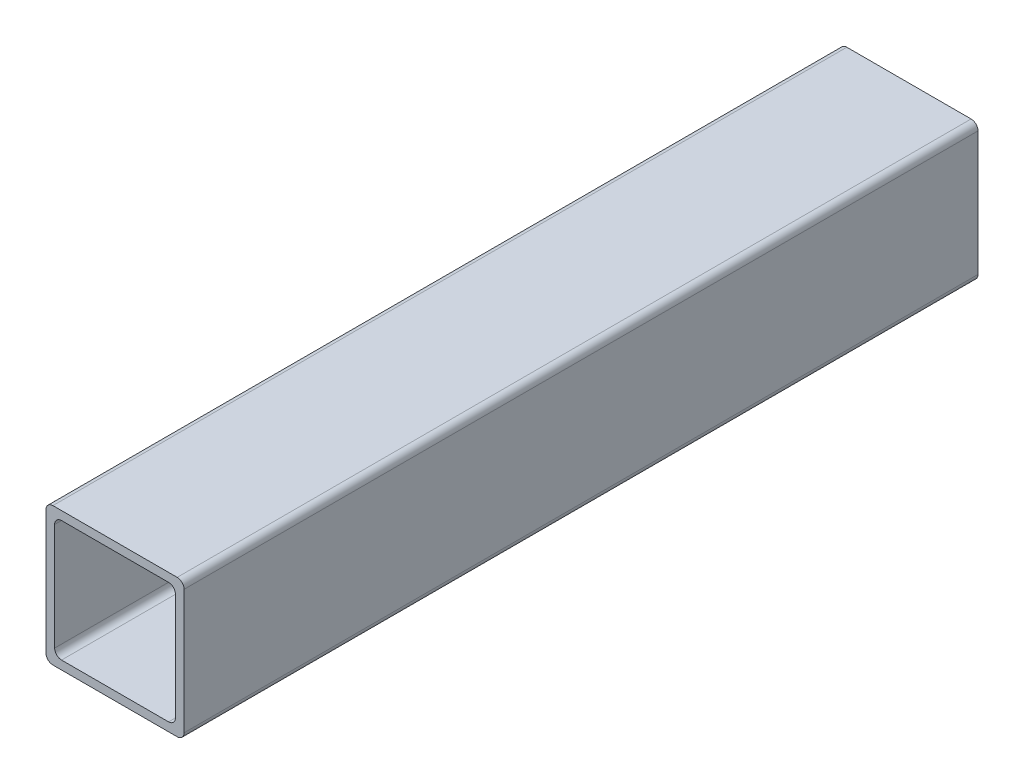
ISO-10303-21;
HEADER;
FILE_DESCRIPTION(('STEP AP214'),'2;1');
FILE_NAME('part.step','',(''),(''),'','','');
FILE_SCHEMA(('AUTOMOTIVE_DESIGN { 1 0 10303 214 1 1 1 1 }'));
ENDSEC;
DATA;
#1=APPLICATION_CONTEXT('core data for automotive mechanical design processes');
#2=APPLICATION_PROTOCOL_DEFINITION('international standard','automotive_design',2000,#1);
#3=PRODUCT_CONTEXT('',#1,'mechanical');
#4=PRODUCT('Part','Part','',(#3));
#5=PRODUCT_RELATED_PRODUCT_CATEGORY('part','',(#4));
#6=PRODUCT_DEFINITION_FORMATION('','',#4);
#7=PRODUCT_DEFINITION_CONTEXT('part definition',#1,'design');
#8=PRODUCT_DEFINITION('design','',#6,#7);
#9=PRODUCT_DEFINITION_SHAPE('','',#8);
#10=(LENGTH_UNIT() NAMED_UNIT(*) SI_UNIT(.MILLI.,.METRE.));
#11=(NAMED_UNIT(*) PLANE_ANGLE_UNIT() SI_UNIT($,.RADIAN.));
#12=(NAMED_UNIT(*) SI_UNIT($,.STERADIAN.) SOLID_ANGLE_UNIT());
#13=UNCERTAINTY_MEASURE_WITH_UNIT(LENGTH_MEASURE(1.E-05),#10,'distance_accuracy_value','');
#14=(GEOMETRIC_REPRESENTATION_CONTEXT(3) GLOBAL_UNCERTAINTY_ASSIGNED_CONTEXT((#13)) GLOBAL_UNIT_ASSIGNED_CONTEXT((#10,
#11,#12)) REPRESENTATION_CONTEXT('',''));
#15=CARTESIAN_POINT('',(0.,0.,0.));
#16=DIRECTION('',(0.,0.,1.));
#17=DIRECTION('',(1.,0.,0.));
#18=AXIS2_PLACEMENT_3D('',#15,#16,#17);
#19=CARTESIAN_POINT('',(-22.86,-22.86,146.05));
#20=DIRECTION('',(0.,0.,-1.));
#21=DIRECTION('',(-1.,0.,0.));
#22=AXIS2_PLACEMENT_3D('',#19,#20,#21);
#23=PLANE('',#22);
#24=CARTESIAN_POINT('',(-22.86,-22.86,146.05));
#25=DIRECTION('',(0.,0.,1.));
#26=DIRECTION('',(-1.,0.,0.));
#27=AXIS2_PLACEMENT_3D('',#24,#25,#26);
#28=CIRCLE('',#27,2.54);
#29=CARTESIAN_POINT('',(-25.4,-22.86,146.05));
#30=VERTEX_POINT('',#29);
#31=CARTESIAN_POINT('',(-22.86,-25.4,146.05));
#32=VERTEX_POINT('',#31);
#33=EDGE_CURVE('E211',#30,#32,#28,.T.);
#34=ORIENTED_EDGE('',*,*,#33,.T.);
#35=DIRECTION('',(1.,0.,0.));
#36=VECTOR('',#35,1.);
#37=CARTESIAN_POINT('',(-22.86,-25.4,146.05));
#38=LINE('',#37,#36);
#39=CARTESIAN_POINT('',(22.86,-25.4,146.05));
#40=VERTEX_POINT('',#39);
#41=EDGE_CURVE('E214',#32,#40,#38,.T.);
#42=ORIENTED_EDGE('',*,*,#41,.T.);
#43=CARTESIAN_POINT('',(22.86,-22.86,146.05));
#44=DIRECTION('',(0.,0.,1.));
#45=DIRECTION('',(1.,0.,0.));
#46=AXIS2_PLACEMENT_3D('',#43,#44,#45);
#47=CIRCLE('',#46,2.54);
#48=CARTESIAN_POINT('',(25.4,-22.86,146.05));
#49=VERTEX_POINT('',#48);
#50=EDGE_CURVE('E217',#40,#49,#47,.T.);
#51=ORIENTED_EDGE('',*,*,#50,.T.);
#52=DIRECTION('',(0.,1.,0.));
#53=VECTOR('',#52,1.);
#54=CARTESIAN_POINT('',(25.4,-22.86,146.05));
#55=LINE('',#54,#53);
#56=CARTESIAN_POINT('',(25.4,22.86,146.05));
#57=VERTEX_POINT('',#56);
#58=EDGE_CURVE('E219',#49,#57,#55,.T.);
#59=ORIENTED_EDGE('',*,*,#58,.T.);
#60=CARTESIAN_POINT('',(22.86,22.86,146.05));
#61=DIRECTION('',(0.,0.,1.));
#62=DIRECTION('',(-1.,0.,0.));
#63=AXIS2_PLACEMENT_3D('',#60,#61,#62);
#64=CIRCLE('',#63,2.54);
#65=CARTESIAN_POINT('',(22.86,25.4,146.05));
#66=VERTEX_POINT('',#65);
#67=EDGE_CURVE('E221',#57,#66,#64,.T.);
#68=ORIENTED_EDGE('',*,*,#67,.T.);
#69=DIRECTION('',(-1.,0.,0.));
#70=VECTOR('',#69,1.);
#71=CARTESIAN_POINT('',(-22.86,25.4,146.05));
#72=LINE('',#71,#70);
#73=CARTESIAN_POINT('',(-22.86,25.4,146.05));
#74=VERTEX_POINT('',#73);
#75=EDGE_CURVE('E223',#66,#74,#72,.T.);
#76=ORIENTED_EDGE('',*,*,#75,.T.);
#77=CARTESIAN_POINT('',(-22.86,22.86,146.05));
#78=DIRECTION('',(0.,0.,1.));
#79=DIRECTION('',(-1.,0.,0.));
#80=AXIS2_PLACEMENT_3D('',#77,#78,#79);
#81=CIRCLE('',#80,2.54);
#82=CARTESIAN_POINT('',(-25.4,22.86,146.05));
#83=VERTEX_POINT('',#82);
#84=EDGE_CURVE('E225',#74,#83,#81,.T.);
#85=ORIENTED_EDGE('',*,*,#84,.T.);
#86=DIRECTION('',(0.,-1.,0.));
#87=VECTOR('',#86,1.);
#88=CARTESIAN_POINT('',(-25.4,-22.86,146.05));
#89=LINE('',#88,#87);
#90=EDGE_CURVE('E227',#83,#30,#89,.T.);
#91=ORIENTED_EDGE('',*,*,#90,.T.);
#92=EDGE_LOOP('',(#34,#42,#51,#59,#68,#76,#85,#91));
#93=FACE_BOUND('',#92,.T.);
#94=CARTESIAN_POINT('',(-19.685,-19.685,146.05));
#95=DIRECTION('',(0.,0.,1.));
#96=DIRECTION('',(-1.,0.,0.));
#97=AXIS2_PLACEMENT_3D('',#94,#95,#96);
#98=CIRCLE('',#97,2.54);
#99=CARTESIAN_POINT('',(-22.225,-19.685,146.05));
#100=VERTEX_POINT('',#99);
#101=CARTESIAN_POINT('',(-19.685,-22.225,146.05));
#102=VERTEX_POINT('',#101);
#103=EDGE_CURVE('E146',#100,#102,#98,.T.);
#104=ORIENTED_EDGE('',*,*,#103,.F.);
#105=DIRECTION('',(0.,-1.,0.));
#106=VECTOR('',#105,1.);
#107=CARTESIAN_POINT('',(-22.225,-19.685,146.05));
#108=LINE('',#107,#106);
#109=CARTESIAN_POINT('',(-22.225,19.685,146.05));
#110=VERTEX_POINT('',#109);
#111=EDGE_CURVE('E179',#110,#100,#108,.T.);
#112=ORIENTED_EDGE('',*,*,#111,.F.);
#113=CARTESIAN_POINT('',(-19.685,19.685,146.05));
#114=DIRECTION('',(0.,0.,1.));
#115=DIRECTION('',(1.,0.,0.));
#116=AXIS2_PLACEMENT_3D('',#113,#114,#115);
#117=CIRCLE('',#116,2.54);
#118=CARTESIAN_POINT('',(-19.685,22.225,146.05));
#119=VERTEX_POINT('',#118);
#120=EDGE_CURVE('E177',#119,#110,#117,.T.);
#121=ORIENTED_EDGE('',*,*,#120,.F.);
#122=DIRECTION('',(-1.,0.,0.));
#123=VECTOR('',#122,1.);
#124=CARTESIAN_POINT('',(-19.685,22.225,146.05));
#125=LINE('',#124,#123);
#126=CARTESIAN_POINT('',(19.685,22.225,146.05));
#127=VERTEX_POINT('',#126);
#128=EDGE_CURVE('E175',#127,#119,#125,.T.);
#129=ORIENTED_EDGE('',*,*,#128,.F.);
#130=CARTESIAN_POINT('',(19.685,19.685,146.05));
#131=DIRECTION('',(0.,0.,1.));
#132=DIRECTION('',(-1.,0.,0.));
#133=AXIS2_PLACEMENT_3D('',#130,#131,#132);
#134=CIRCLE('',#133,2.54);
#135=CARTESIAN_POINT('',(22.225,19.685,146.05));
#136=VERTEX_POINT('',#135);
#137=EDGE_CURVE('E173',#136,#127,#134,.T.);
#138=ORIENTED_EDGE('',*,*,#137,.F.);
#139=DIRECTION('',(0.,1.,0.));
#140=VECTOR('',#139,1.);
#141=CARTESIAN_POINT('',(22.225,-19.685,146.05));
#142=LINE('',#141,#140);
#143=CARTESIAN_POINT('',(22.225,-19.685,146.05));
#144=VERTEX_POINT('',#143);
#145=EDGE_CURVE('E169',#144,#136,#142,.T.);
#146=ORIENTED_EDGE('',*,*,#145,.F.);
#147=CARTESIAN_POINT('',(19.685,-19.685,146.05));
#148=DIRECTION('',(0.,0.,1.));
#149=DIRECTION('',(-1.,0.,0.));
#150=AXIS2_PLACEMENT_3D('',#147,#148,#149);
#151=CIRCLE('',#150,2.54);
#152=CARTESIAN_POINT('',(19.685,-22.225,146.05));
#153=VERTEX_POINT('',#152);
#154=EDGE_CURVE('E167',#153,#144,#151,.T.);
#155=ORIENTED_EDGE('',*,*,#154,.F.);
#156=DIRECTION('',(1.,0.,0.));
#157=VECTOR('',#156,1.);
#158=CARTESIAN_POINT('',(-19.685,-22.225,146.05));
#159=LINE('',#158,#157);
#160=EDGE_CURVE('E154',#102,#153,#159,.T.);
#161=ORIENTED_EDGE('',*,*,#160,.F.);
#162=EDGE_LOOP('',(#104,#112,#121,#129,#138,#146,#155,#161));
#163=FACE_BOUND('',#162,.T.);
#164=ADVANCED_FACE('F33',(#93,#163),#23,.F.);
#165=CARTESIAN_POINT('',(-22.86,-22.86,-146.05));
#166=DIRECTION('',(0.,0.,-1.));
#167=DIRECTION('',(-1.,0.,0.));
#168=AXIS2_PLACEMENT_3D('',#165,#166,#167);
#169=PLANE('',#168);
#170=CARTESIAN_POINT('',(-22.86,-22.86,-146.05));
#171=DIRECTION('',(0.,0.,1.));
#172=DIRECTION('',(-1.,0.,0.));
#173=AXIS2_PLACEMENT_3D('',#170,#171,#172);
#174=CIRCLE('',#173,2.54);
#175=CARTESIAN_POINT('',(-25.4,-22.86,-146.05));
#176=VERTEX_POINT('',#175);
#177=CARTESIAN_POINT('',(-22.86,-25.4,-146.05));
#178=VERTEX_POINT('',#177);
#179=EDGE_CURVE('E162',#176,#178,#174,.T.);
#180=ORIENTED_EDGE('',*,*,#179,.F.);
#181=DIRECTION('',(0.,-1.,0.));
#182=VECTOR('',#181,1.);
#183=CARTESIAN_POINT('',(-25.4,-22.86,-146.05));
#184=LINE('',#183,#182);
#185=CARTESIAN_POINT('',(-25.4,22.86,-146.05));
#186=VERTEX_POINT('',#185);
#187=EDGE_CURVE('E215',#186,#176,#184,.T.);
#188=ORIENTED_EDGE('',*,*,#187,.F.);
#189=CARTESIAN_POINT('',(-22.86,22.86,-146.05));
#190=DIRECTION('',(0.,0.,1.));
#191=DIRECTION('',(-1.,0.,0.));
#192=AXIS2_PLACEMENT_3D('',#189,#190,#191);
#193=CIRCLE('',#192,2.54);
#194=CARTESIAN_POINT('',(-22.86,25.4,-146.05));
#195=VERTEX_POINT('',#194);
#196=EDGE_CURVE('E242',#195,#186,#193,.T.);
#197=ORIENTED_EDGE('',*,*,#196,.F.);
#198=DIRECTION('',(-1.,0.,0.));
#199=VECTOR('',#198,1.);
#200=CARTESIAN_POINT('',(-22.86,25.4,-146.05));
#201=LINE('',#200,#199);
#202=CARTESIAN_POINT('',(22.86,25.4,-146.05));
#203=VERTEX_POINT('',#202);
#204=EDGE_CURVE('E240',#203,#195,#201,.T.);
#205=ORIENTED_EDGE('',*,*,#204,.F.);
#206=CARTESIAN_POINT('',(22.86,22.86,-146.05));
#207=DIRECTION('',(0.,0.,1.));
#208=DIRECTION('',(-1.,0.,0.));
#209=AXIS2_PLACEMENT_3D('',#206,#207,#208);
#210=CIRCLE('',#209,2.54);
#211=CARTESIAN_POINT('',(25.4,22.86,-146.05));
#212=VERTEX_POINT('',#211);
#213=EDGE_CURVE('E238',#212,#203,#210,.T.);
#214=ORIENTED_EDGE('',*,*,#213,.F.);
#215=DIRECTION('',(0.,1.,0.));
#216=VECTOR('',#215,1.);
#217=CARTESIAN_POINT('',(25.4,-22.86,-146.05));
#218=LINE('',#217,#216);
#219=CARTESIAN_POINT('',(25.4,-22.86,-146.05));
#220=VERTEX_POINT('',#219);
#221=EDGE_CURVE('E236',#220,#212,#218,.T.);
#222=ORIENTED_EDGE('',*,*,#221,.F.);
#223=CARTESIAN_POINT('',(22.86,-22.86,-146.05));
#224=DIRECTION('',(0.,0.,1.));
#225=DIRECTION('',(1.,0.,0.));
#226=AXIS2_PLACEMENT_3D('',#223,#224,#225);
#227=CIRCLE('',#226,2.54);
#228=CARTESIAN_POINT('',(22.86,-25.4,-146.05));
#229=VERTEX_POINT('',#228);
#230=EDGE_CURVE('E234',#229,#220,#227,.T.);
#231=ORIENTED_EDGE('',*,*,#230,.F.);
#232=DIRECTION('',(1.,0.,0.));
#233=VECTOR('',#232,1.);
#234=CARTESIAN_POINT('',(-22.86,-25.4,-146.05));
#235=LINE('',#234,#233);
#236=EDGE_CURVE('E232',#178,#229,#235,.T.);
#237=ORIENTED_EDGE('',*,*,#236,.F.);
#238=EDGE_LOOP('',(#180,#188,#197,#205,#214,#222,#231,#237));
#239=FACE_BOUND('',#238,.T.);
#240=DIRECTION('',(0.,-1.,0.));
#241=VECTOR('',#240,1.);
#242=CARTESIAN_POINT('',(-22.225,-19.685,-146.05));
#243=LINE('',#242,#241);
#244=CARTESIAN_POINT('',(-22.225,19.685,-146.05));
#245=VERTEX_POINT('',#244);
#246=CARTESIAN_POINT('',(-22.225,-19.685,-146.05));
#247=VERTEX_POINT('',#246);
#248=EDGE_CURVE('E155',#245,#247,#243,.T.);
#249=ORIENTED_EDGE('',*,*,#248,.T.);
#250=CARTESIAN_POINT('',(-19.685,-19.685,-146.05));
#251=DIRECTION('',(0.,0.,1.));
#252=DIRECTION('',(-1.,0.,0.));
#253=AXIS2_PLACEMENT_3D('',#250,#251,#252);
#254=CIRCLE('',#253,2.54);
#255=CARTESIAN_POINT('',(-19.685,-22.225,-146.05));
#256=VERTEX_POINT('',#255);
#257=EDGE_CURVE('E56',#247,#256,#254,.T.);
#258=ORIENTED_EDGE('',*,*,#257,.T.);
#259=DIRECTION('',(1.,0.,0.));
#260=VECTOR('',#259,1.);
#261=CARTESIAN_POINT('',(-19.685,-22.225,-146.05));
#262=LINE('',#261,#260);
#263=CARTESIAN_POINT('',(19.685,-22.225,-146.05));
#264=VERTEX_POINT('',#263);
#265=EDGE_CURVE('E161',#256,#264,#262,.T.);
#266=ORIENTED_EDGE('',*,*,#265,.T.);
#267=CARTESIAN_POINT('',(19.685,-19.685,-146.05));
#268=DIRECTION('',(0.,0.,1.));
#269=DIRECTION('',(-1.,0.,0.));
#270=AXIS2_PLACEMENT_3D('',#267,#268,#269);
#271=CIRCLE('',#270,2.54);
#272=CARTESIAN_POINT('',(22.225,-19.685,-146.05));
#273=VERTEX_POINT('',#272);
#274=EDGE_CURVE('E183',#264,#273,#271,.T.);
#275=ORIENTED_EDGE('',*,*,#274,.T.);
#276=DIRECTION('',(0.,1.,0.));
#277=VECTOR('',#276,1.);
#278=CARTESIAN_POINT('',(22.225,-19.685,-146.05));
#279=LINE('',#278,#277);
#280=CARTESIAN_POINT('',(22.225,19.685,-146.05));
#281=VERTEX_POINT('',#280);
#282=EDGE_CURVE('E186',#273,#281,#279,.T.);
#283=ORIENTED_EDGE('',*,*,#282,.T.);
#284=CARTESIAN_POINT('',(19.685,19.685,-146.05));
#285=DIRECTION('',(0.,0.,1.));
#286=DIRECTION('',(-1.,0.,0.));
#287=AXIS2_PLACEMENT_3D('',#284,#285,#286);
#288=CIRCLE('',#287,2.54);
#289=CARTESIAN_POINT('',(19.685,22.225,-146.05));
#290=VERTEX_POINT('',#289);
#291=EDGE_CURVE('E189',#281,#290,#288,.T.);
#292=ORIENTED_EDGE('',*,*,#291,.T.);
#293=DIRECTION('',(-1.,0.,0.));
#294=VECTOR('',#293,1.);
#295=CARTESIAN_POINT('',(-19.685,22.225,-146.05));
#296=LINE('',#295,#294);
#297=CARTESIAN_POINT('',(-19.685,22.225,-146.05));
#298=VERTEX_POINT('',#297);
#299=EDGE_CURVE('E192',#290,#298,#296,.T.);
#300=ORIENTED_EDGE('',*,*,#299,.T.);
#301=CARTESIAN_POINT('',(-19.685,19.685,-146.05));
#302=DIRECTION('',(0.,0.,1.));
#303=DIRECTION('',(1.,0.,0.));
#304=AXIS2_PLACEMENT_3D('',#301,#302,#303);
#305=CIRCLE('',#304,2.54);
#306=EDGE_CURVE('E195',#298,#245,#305,.T.);
#307=ORIENTED_EDGE('',*,*,#306,.T.);
#308=EDGE_LOOP('',(#249,#258,#266,#275,#283,#292,#300,#307));
#309=FACE_BOUND('',#308,.T.);
#310=ADVANCED_FACE('F272',(#239,#309),#169,.T.);
#311=CARTESIAN_POINT('',(-22.86,-22.86,146.05));
#312=DIRECTION('',(0.,0.,-1.));
#313=DIRECTION('',(-1.,0.,0.));
#314=AXIS2_PLACEMENT_3D('',#311,#312,#313);
#315=CYLINDRICAL_SURFACE('',#314,2.54);
#316=ORIENTED_EDGE('',*,*,#179,.T.);
#317=DIRECTION('',(0.,0.,-1.));
#318=VECTOR('',#317,1.);
#319=CARTESIAN_POINT('',(-22.86,-25.4,146.05));
#320=LINE('',#319,#318);
#321=EDGE_CURVE('E11',#32,#178,#320,.T.);
#322=ORIENTED_EDGE('',*,*,#321,.F.);
#323=ORIENTED_EDGE('',*,*,#33,.F.);
#324=DIRECTION('',(0.,0.,-1.));
#325=VECTOR('',#324,1.);
#326=CARTESIAN_POINT('',(-25.4,-22.86,146.05));
#327=LINE('',#326,#325);
#328=EDGE_CURVE('E229',#30,#176,#327,.T.);
#329=ORIENTED_EDGE('',*,*,#328,.T.);
#330=EDGE_LOOP('',(#316,#322,#323,#329));
#331=FACE_BOUND('',#330,.T.);
#332=ADVANCED_FACE('F35',(#331),#315,.T.);
#333=CARTESIAN_POINT('',(-22.86,-25.4,146.05));
#334=DIRECTION('',(0.,1.,0.));
#335=DIRECTION('',(0.,0.,1.));
#336=AXIS2_PLACEMENT_3D('',#333,#334,#335);
#337=PLANE('',#336);
#338=ORIENTED_EDGE('',*,*,#236,.T.);
#339=DIRECTION('',(0.,0.,-1.));
#340=VECTOR('',#339,1.);
#341=CARTESIAN_POINT('',(22.86,-25.4,146.05));
#342=LINE('',#341,#340);
#343=EDGE_CURVE('E41',#40,#229,#342,.T.);
#344=ORIENTED_EDGE('',*,*,#343,.F.);
#345=ORIENTED_EDGE('',*,*,#41,.F.);
#346=ORIENTED_EDGE('',*,*,#321,.T.);
#347=EDGE_LOOP('',(#338,#344,#345,#346));
#348=FACE_BOUND('',#347,.T.);
#349=ADVANCED_FACE('F289',(#348),#337,.F.);
#350=CARTESIAN_POINT('',(22.86,-22.86,146.05));
#351=DIRECTION('',(0.,0.,-1.));
#352=DIRECTION('',(-1.,0.,0.));
#353=AXIS2_PLACEMENT_3D('',#350,#351,#352);
#354=CYLINDRICAL_SURFACE('',#353,2.54);
#355=ORIENTED_EDGE('',*,*,#230,.T.);
#356=DIRECTION('',(0.,0.,-1.));
#357=VECTOR('',#356,1.);
#358=CARTESIAN_POINT('',(25.4,-22.86,146.05));
#359=LINE('',#358,#357);
#360=EDGE_CURVE('E259',#49,#220,#359,.T.);
#361=ORIENTED_EDGE('',*,*,#360,.F.);
#362=ORIENTED_EDGE('',*,*,#50,.F.);
#363=ORIENTED_EDGE('',*,*,#343,.T.);
#364=EDGE_LOOP('',(#355,#361,#362,#363));
#365=FACE_BOUND('',#364,.T.);
#366=ADVANCED_FACE('F266',(#365),#354,.T.);
#367=CARTESIAN_POINT('',(25.4,-22.86,146.05));
#368=DIRECTION('',(-1.,0.,0.));
#369=DIRECTION('',(0.,0.,1.));
#370=AXIS2_PLACEMENT_3D('',#367,#368,#369);
#371=PLANE('',#370);
#372=ORIENTED_EDGE('',*,*,#221,.T.);
#373=DIRECTION('',(0.,0.,-1.));
#374=VECTOR('',#373,1.);
#375=CARTESIAN_POINT('',(25.4,22.86,146.05));
#376=LINE('',#375,#374);
#377=EDGE_CURVE('E256',#57,#212,#376,.T.);
#378=ORIENTED_EDGE('',*,*,#377,.F.);
#379=ORIENTED_EDGE('',*,*,#58,.F.);
#380=ORIENTED_EDGE('',*,*,#360,.T.);
#381=EDGE_LOOP('',(#372,#378,#379,#380));
#382=FACE_BOUND('',#381,.T.);
#383=ADVANCED_FACE('F278',(#382),#371,.F.);
#384=CARTESIAN_POINT('',(22.86,22.86,146.05));
#385=DIRECTION('',(0.,0.,-1.));
#386=DIRECTION('',(-1.,0.,0.));
#387=AXIS2_PLACEMENT_3D('',#384,#385,#386);
#388=CYLINDRICAL_SURFACE('',#387,2.54);
#389=ORIENTED_EDGE('',*,*,#213,.T.);
#390=DIRECTION('',(0.,0.,-1.));
#391=VECTOR('',#390,1.);
#392=CARTESIAN_POINT('',(22.86,25.4,146.05));
#393=LINE('',#392,#391);
#394=EDGE_CURVE('E253',#66,#203,#393,.T.);
#395=ORIENTED_EDGE('',*,*,#394,.F.);
#396=ORIENTED_EDGE('',*,*,#67,.F.);
#397=ORIENTED_EDGE('',*,*,#377,.T.);
#398=EDGE_LOOP('',(#389,#395,#396,#397));
#399=FACE_BOUND('',#398,.T.);
#400=ADVANCED_FACE('F282',(#399),#388,.T.);
#401=CARTESIAN_POINT('',(-22.86,25.4,146.05));
#402=DIRECTION('',(0.,-1.,0.));
#403=DIRECTION('',(0.,0.,-1.));
#404=AXIS2_PLACEMENT_3D('',#401,#402,#403);
#405=PLANE('',#404);
#406=ORIENTED_EDGE('',*,*,#204,.T.);
#407=DIRECTION('',(0.,0.,-1.));
#408=VECTOR('',#407,1.);
#409=CARTESIAN_POINT('',(-22.86,25.4,146.05));
#410=LINE('',#409,#408);
#411=EDGE_CURVE('E250',#74,#195,#410,.T.);
#412=ORIENTED_EDGE('',*,*,#411,.F.);
#413=ORIENTED_EDGE('',*,*,#75,.F.);
#414=ORIENTED_EDGE('',*,*,#394,.T.);
#415=EDGE_LOOP('',(#406,#412,#413,#414));
#416=FACE_BOUND('',#415,.T.);
#417=ADVANCED_FACE('F302',(#416),#405,.F.);
#418=CARTESIAN_POINT('',(-22.86,22.86,146.05));
#419=DIRECTION('',(0.,0.,-1.));
#420=DIRECTION('',(-1.,0.,0.));
#421=AXIS2_PLACEMENT_3D('',#418,#419,#420);
#422=CYLINDRICAL_SURFACE('',#421,2.54);
#423=ORIENTED_EDGE('',*,*,#196,.T.);
#424=DIRECTION('',(0.,0.,-1.));
#425=VECTOR('',#424,1.);
#426=CARTESIAN_POINT('',(-25.4,22.86,146.05));
#427=LINE('',#426,#425);
#428=EDGE_CURVE('E247',#83,#186,#427,.T.);
#429=ORIENTED_EDGE('',*,*,#428,.F.);
#430=ORIENTED_EDGE('',*,*,#84,.F.);
#431=ORIENTED_EDGE('',*,*,#411,.T.);
#432=EDGE_LOOP('',(#423,#429,#430,#431));
#433=FACE_BOUND('',#432,.T.);
#434=ADVANCED_FACE('F300',(#433),#422,.T.);
#435=CARTESIAN_POINT('',(-25.4,-22.86,146.05));
#436=DIRECTION('',(1.,0.,0.));
#437=DIRECTION('',(0.,0.,-1.));
#438=AXIS2_PLACEMENT_3D('',#435,#436,#437);
#439=PLANE('',#438);
#440=ORIENTED_EDGE('',*,*,#187,.T.);
#441=ORIENTED_EDGE('',*,*,#328,.F.);
#442=ORIENTED_EDGE('',*,*,#90,.F.);
#443=ORIENTED_EDGE('',*,*,#428,.T.);
#444=EDGE_LOOP('',(#440,#441,#442,#443));
#445=FACE_BOUND('',#444,.T.);
#446=ADVANCED_FACE('F295',(#445),#439,.F.);
#447=CARTESIAN_POINT('',(-19.685,-19.685,146.05));
#448=DIRECTION('',(0.,0.,-1.));
#449=DIRECTION('',(-1.,0.,0.));
#450=AXIS2_PLACEMENT_3D('',#447,#448,#449);
#451=CYLINDRICAL_SURFACE('',#450,2.54);
#452=ORIENTED_EDGE('',*,*,#257,.F.);
#453=DIRECTION('',(0.,0.,-1.));
#454=VECTOR('',#453,1.);
#455=CARTESIAN_POINT('',(-22.225,-19.685,146.05));
#456=LINE('',#455,#454);
#457=EDGE_CURVE('E150',#100,#247,#456,.T.);
#458=ORIENTED_EDGE('',*,*,#457,.F.);
#459=ORIENTED_EDGE('',*,*,#103,.T.);
#460=DIRECTION('',(0.,0.,-1.));
#461=VECTOR('',#460,1.);
#462=CARTESIAN_POINT('',(-19.685,-22.225,146.05));
#463=LINE('',#462,#461);
#464=EDGE_CURVE('E149',#102,#256,#463,.T.);
#465=ORIENTED_EDGE('',*,*,#464,.T.);
#466=EDGE_LOOP('',(#452,#458,#459,#465));
#467=FACE_BOUND('',#466,.T.);
#468=ADVANCED_FACE('F148',(#467),#451,.F.);
#469=CARTESIAN_POINT('',(-19.685,-22.225,146.05));
#470=DIRECTION('',(0.,1.,0.));
#471=DIRECTION('',(0.,0.,1.));
#472=AXIS2_PLACEMENT_3D('',#469,#470,#471);
#473=PLANE('',#472);
#474=ORIENTED_EDGE('',*,*,#265,.F.);
#475=ORIENTED_EDGE('',*,*,#464,.F.);
#476=ORIENTED_EDGE('',*,*,#160,.T.);
#477=DIRECTION('',(0.,0.,-1.));
#478=VECTOR('',#477,1.);
#479=CARTESIAN_POINT('',(19.685,-22.225,146.05));
#480=LINE('',#479,#478);
#481=EDGE_CURVE('E163',#153,#264,#480,.T.);
#482=ORIENTED_EDGE('',*,*,#481,.T.);
#483=EDGE_LOOP('',(#474,#475,#476,#482));
#484=FACE_BOUND('',#483,.T.);
#485=ADVANCED_FACE('F158',(#484),#473,.T.);
#486=CARTESIAN_POINT('',(19.685,-19.685,146.05));
#487=DIRECTION('',(0.,0.,-1.));
#488=DIRECTION('',(-1.,0.,0.));
#489=AXIS2_PLACEMENT_3D('',#486,#487,#488);
#490=CYLINDRICAL_SURFACE('',#489,2.54);
#491=ORIENTED_EDGE('',*,*,#274,.F.);
#492=ORIENTED_EDGE('',*,*,#481,.F.);
#493=ORIENTED_EDGE('',*,*,#154,.T.);
#494=DIRECTION('',(0.,0.,-1.));
#495=VECTOR('',#494,1.);
#496=CARTESIAN_POINT('',(22.225,-19.685,146.05));
#497=LINE('',#496,#495);
#498=EDGE_CURVE('E208',#144,#273,#497,.T.);
#499=ORIENTED_EDGE('',*,*,#498,.T.);
#500=EDGE_LOOP('',(#491,#492,#493,#499));
#501=FACE_BOUND('',#500,.T.);
#502=ADVANCED_FACE('F327',(#501),#490,.F.);
#503=CARTESIAN_POINT('',(22.225,-19.685,146.05));
#504=DIRECTION('',(-1.,0.,0.));
#505=DIRECTION('',(0.,-1.,0.));
#506=AXIS2_PLACEMENT_3D('',#503,#504,#505);
#507=PLANE('',#506);
#508=ORIENTED_EDGE('',*,*,#282,.F.);
#509=ORIENTED_EDGE('',*,*,#498,.F.);
#510=ORIENTED_EDGE('',*,*,#145,.T.);
#511=DIRECTION('',(0.,0.,-1.));
#512=VECTOR('',#511,1.);
#513=CARTESIAN_POINT('',(22.225,19.685,146.05));
#514=LINE('',#513,#512);
#515=EDGE_CURVE('E206',#136,#281,#514,.T.);
#516=ORIENTED_EDGE('',*,*,#515,.T.);
#517=EDGE_LOOP('',(#508,#509,#510,#516));
#518=FACE_BOUND('',#517,.T.);
#519=ADVANCED_FACE('F331',(#518),#507,.T.);
#520=CARTESIAN_POINT('',(19.685,19.685,146.05));
#521=DIRECTION('',(0.,0.,-1.));
#522=DIRECTION('',(-1.,0.,0.));
#523=AXIS2_PLACEMENT_3D('',#520,#521,#522);
#524=CYLINDRICAL_SURFACE('',#523,2.54);
#525=ORIENTED_EDGE('',*,*,#291,.F.);
#526=ORIENTED_EDGE('',*,*,#515,.F.);
#527=ORIENTED_EDGE('',*,*,#137,.T.);
#528=DIRECTION('',(0.,0.,-1.));
#529=VECTOR('',#528,1.);
#530=CARTESIAN_POINT('',(19.685,22.225,146.05));
#531=LINE('',#530,#529);
#532=EDGE_CURVE('E204',#127,#290,#531,.T.);
#533=ORIENTED_EDGE('',*,*,#532,.T.);
#534=EDGE_LOOP('',(#525,#526,#527,#533));
#535=FACE_BOUND('',#534,.T.);
#536=ADVANCED_FACE('F337',(#535),#524,.F.);
#537=CARTESIAN_POINT('',(-19.685,22.225,146.05));
#538=DIRECTION('',(0.,-1.,0.));
#539=DIRECTION('',(0.,0.,-1.));
#540=AXIS2_PLACEMENT_3D('',#537,#538,#539);
#541=PLANE('',#540);
#542=ORIENTED_EDGE('',*,*,#299,.F.);
#543=ORIENTED_EDGE('',*,*,#532,.F.);
#544=ORIENTED_EDGE('',*,*,#128,.T.);
#545=DIRECTION('',(0.,0.,-1.));
#546=VECTOR('',#545,1.);
#547=CARTESIAN_POINT('',(-19.685,22.225,146.05));
#548=LINE('',#547,#546);
#549=EDGE_CURVE('E202',#119,#298,#548,.T.);
#550=ORIENTED_EDGE('',*,*,#549,.T.);
#551=EDGE_LOOP('',(#542,#543,#544,#550));
#552=FACE_BOUND('',#551,.T.);
#553=ADVANCED_FACE('F341',(#552),#541,.T.);
#554=CARTESIAN_POINT('',(-19.685,19.685,146.05));
#555=DIRECTION('',(0.,0.,-1.));
#556=DIRECTION('',(-1.,0.,0.));
#557=AXIS2_PLACEMENT_3D('',#554,#555,#556);
#558=CYLINDRICAL_SURFACE('',#557,2.54);
#559=ORIENTED_EDGE('',*,*,#306,.F.);
#560=ORIENTED_EDGE('',*,*,#549,.F.);
#561=ORIENTED_EDGE('',*,*,#120,.T.);
#562=DIRECTION('',(0.,0.,-1.));
#563=VECTOR('',#562,1.);
#564=CARTESIAN_POINT('',(-22.225,19.685,146.05));
#565=LINE('',#564,#563);
#566=EDGE_CURVE('E48',#110,#245,#565,.T.);
#567=ORIENTED_EDGE('',*,*,#566,.T.);
#568=EDGE_LOOP('',(#559,#560,#561,#567));
#569=FACE_BOUND('',#568,.T.);
#570=ADVANCED_FACE('F345',(#569),#558,.F.);
#571=CARTESIAN_POINT('',(-22.225,-19.685,146.05));
#572=DIRECTION('',(1.,0.,0.));
#573=DIRECTION('',(0.,0.,-1.));
#574=AXIS2_PLACEMENT_3D('',#571,#572,#573);
#575=PLANE('',#574);
#576=ORIENTED_EDGE('',*,*,#248,.F.);
#577=ORIENTED_EDGE('',*,*,#566,.F.);
#578=ORIENTED_EDGE('',*,*,#111,.T.);
#579=ORIENTED_EDGE('',*,*,#457,.T.);
#580=EDGE_LOOP('',(#576,#577,#578,#579));
#581=FACE_BOUND('',#580,.T.);
#582=ADVANCED_FACE('F349',(#581),#575,.T.);
#583=CLOSED_SHELL('',(#164,#310,#332,#349,#366,#383,#400,#417,#434,#446,#468,#485,#502,#519,
#536,#553,#570,#582));
#584=MANIFOLD_SOLID_BREP('B2',#583);
#585=ADVANCED_BREP_SHAPE_REPRESENTATION('',(#18,#584),#14);
#586=SHAPE_DEFINITION_REPRESENTATION(#9,#585);
ENDSEC;
END-ISO-10303-21;
